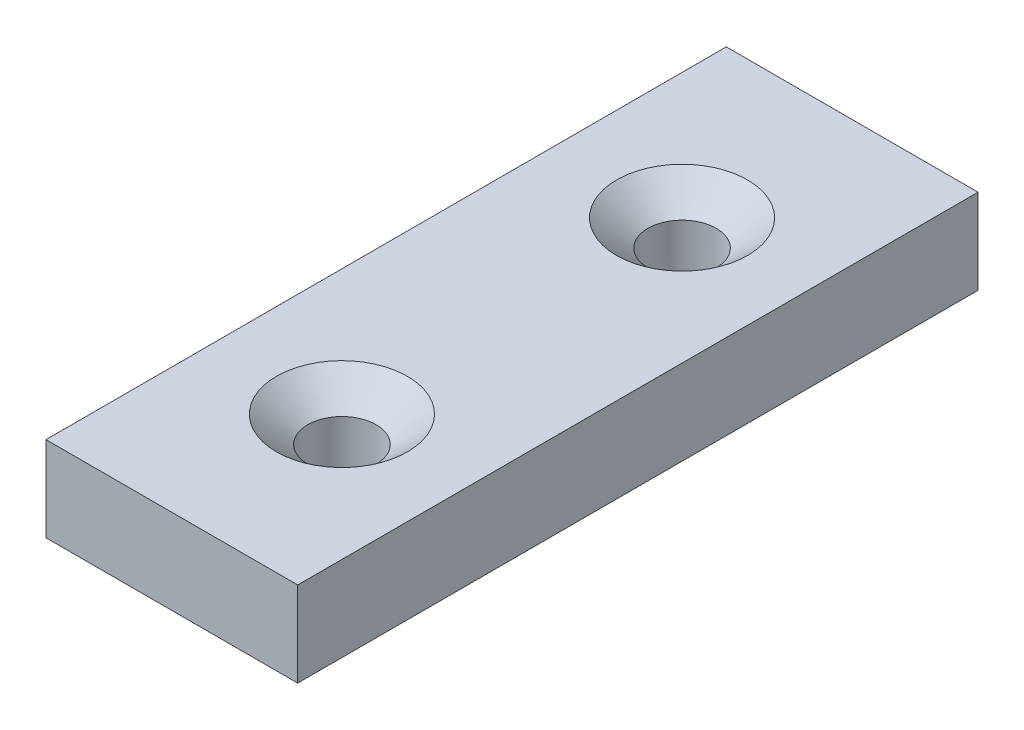
ISO-10303-21;
HEADER;
FILE_DESCRIPTION(('STEP AP214'),'2;1');
FILE_NAME('part.step','',(''),(''),'','','');
FILE_SCHEMA(('AUTOMOTIVE_DESIGN { 1 0 10303 214 1 1 1 1 }'));
ENDSEC;
DATA;
#1=APPLICATION_CONTEXT('core data for automotive mechanical design processes');
#2=APPLICATION_PROTOCOL_DEFINITION('international standard','automotive_design',2000,#1);
#3=PRODUCT_CONTEXT('',#1,'mechanical');
#4=PRODUCT('Part','Part','',(#3));
#5=PRODUCT_RELATED_PRODUCT_CATEGORY('part','',(#4));
#6=PRODUCT_DEFINITION_FORMATION('','',#4);
#7=PRODUCT_DEFINITION_CONTEXT('part definition',#1,'design');
#8=PRODUCT_DEFINITION('design','',#6,#7);
#9=PRODUCT_DEFINITION_SHAPE('','',#8);
#10=(LENGTH_UNIT() NAMED_UNIT(*) SI_UNIT(.MILLI.,.METRE.));
#11=(NAMED_UNIT(*) PLANE_ANGLE_UNIT() SI_UNIT($,.RADIAN.));
#12=(NAMED_UNIT(*) SI_UNIT($,.STERADIAN.) SOLID_ANGLE_UNIT());
#13=UNCERTAINTY_MEASURE_WITH_UNIT(LENGTH_MEASURE(1.E-05),#10,'distance_accuracy_value','');
#14=(GEOMETRIC_REPRESENTATION_CONTEXT(3) GLOBAL_UNCERTAINTY_ASSIGNED_CONTEXT((#13)) GLOBAL_UNIT_ASSIGNED_CONTEXT((#10,
#11,#12)) REPRESENTATION_CONTEXT('',''));
#15=CARTESIAN_POINT('',(0.,0.,0.));
#16=DIRECTION('',(0.,0.,1.));
#17=DIRECTION('',(1.,0.,0.));
#18=AXIS2_PLACEMENT_3D('',#15,#16,#17);
#19=CARTESIAN_POINT('',(0.,6.35,0.));
#20=DIRECTION('',(1.,0.,0.));
#21=DIRECTION('',(0.,0.,-1.));
#22=AXIS2_PLACEMENT_3D('',#19,#20,#21);
#23=PLANE('',#22);
#24=DIRECTION('',(0.,0.,1.));
#25=VECTOR('',#24,1.);
#26=CARTESIAN_POINT('',(0.,0.,0.));
#27=LINE('',#26,#25);
#28=CARTESIAN_POINT('',(0.,0.,-50.8));
#29=VERTEX_POINT('',#28);
#30=CARTESIAN_POINT('',(0.,0.,0.));
#31=VERTEX_POINT('',#30);
#32=EDGE_CURVE('E110',#29,#31,#27,.T.);
#33=ORIENTED_EDGE('',*,*,#32,.T.);
#34=DIRECTION('',(0.,-1.,0.));
#35=VECTOR('',#34,1.);
#36=CARTESIAN_POINT('',(0.,6.35,0.));
#37=LINE('',#36,#35);
#38=CARTESIAN_POINT('',(0.,6.35,0.));
#39=VERTEX_POINT('',#38);
#40=EDGE_CURVE('E11',#39,#31,#37,.T.);
#41=ORIENTED_EDGE('',*,*,#40,.F.);
#42=DIRECTION('',(0.,0.,1.));
#43=VECTOR('',#42,1.);
#44=CARTESIAN_POINT('',(0.,6.35,0.));
#45=LINE('',#44,#43);
#46=CARTESIAN_POINT('',(0.,6.35,-50.8));
#47=VERTEX_POINT('',#46);
#48=EDGE_CURVE('E93',#47,#39,#45,.T.);
#49=ORIENTED_EDGE('',*,*,#48,.F.);
#50=DIRECTION('',(0.,-1.,0.));
#51=VECTOR('',#50,1.);
#52=CARTESIAN_POINT('',(0.,6.35,-50.8));
#53=LINE('',#52,#51);
#54=EDGE_CURVE('E106',#47,#29,#53,.T.);
#55=ORIENTED_EDGE('',*,*,#54,.T.);
#56=EDGE_LOOP('',(#33,#41,#49,#55));
#57=FACE_BOUND('',#56,.T.);
#58=ADVANCED_FACE('F39',(#57),#23,.F.);
#59=CARTESIAN_POINT('',(0.,6.35,0.));
#60=DIRECTION('',(0.,0.,-1.));
#61=DIRECTION('',(-1.,0.,0.));
#62=AXIS2_PLACEMENT_3D('',#59,#60,#61);
#63=PLANE('',#62);
#64=DIRECTION('',(1.,0.,0.));
#65=VECTOR('',#64,1.);
#66=CARTESIAN_POINT('',(0.,0.,0.));
#67=LINE('',#66,#65);
#68=CARTESIAN_POINT('',(18.796,0.,0.));
#69=VERTEX_POINT('',#68);
#70=EDGE_CURVE('E98',#31,#69,#67,.T.);
#71=ORIENTED_EDGE('',*,*,#70,.T.);
#72=DIRECTION('',(0.,-1.,0.));
#73=VECTOR('',#72,1.);
#74=CARTESIAN_POINT('',(18.796,6.35,0.));
#75=LINE('',#74,#73);
#76=CARTESIAN_POINT('',(18.796,6.35,0.));
#77=VERTEX_POINT('',#76);
#78=EDGE_CURVE('E49',#77,#69,#75,.T.);
#79=ORIENTED_EDGE('',*,*,#78,.F.);
#80=DIRECTION('',(1.,0.,0.));
#81=VECTOR('',#80,1.);
#82=CARTESIAN_POINT('',(0.,6.35,0.));
#83=LINE('',#82,#81);
#84=EDGE_CURVE('E88',#39,#77,#83,.T.);
#85=ORIENTED_EDGE('',*,*,#84,.F.);
#86=ORIENTED_EDGE('',*,*,#40,.T.);
#87=EDGE_LOOP('',(#71,#79,#85,#86));
#88=FACE_BOUND('',#87,.T.);
#89=ADVANCED_FACE('F97',(#88),#63,.F.);
#90=CARTESIAN_POINT('',(18.796,6.35,0.));
#91=DIRECTION('',(-1.,0.,0.));
#92=DIRECTION('',(0.,0.,1.));
#93=AXIS2_PLACEMENT_3D('',#90,#91,#92);
#94=PLANE('',#93);
#95=DIRECTION('',(0.,0.,-1.));
#96=VECTOR('',#95,1.);
#97=CARTESIAN_POINT('',(18.796,0.,0.));
#98=LINE('',#97,#96);
#99=CARTESIAN_POINT('',(18.796,0.,-50.8));
#100=VERTEX_POINT('',#99);
#101=EDGE_CURVE('E75',#69,#100,#98,.T.);
#102=ORIENTED_EDGE('',*,*,#101,.T.);
#103=DIRECTION('',(0.,-1.,0.));
#104=VECTOR('',#103,1.);
#105=CARTESIAN_POINT('',(18.796,6.35,-50.8));
#106=LINE('',#105,#104);
#107=CARTESIAN_POINT('',(18.796,6.35,-50.8));
#108=VERTEX_POINT('',#107);
#109=EDGE_CURVE('E100',#108,#100,#106,.T.);
#110=ORIENTED_EDGE('',*,*,#109,.F.);
#111=DIRECTION('',(0.,0.,-1.));
#112=VECTOR('',#111,1.);
#113=CARTESIAN_POINT('',(18.796,6.35,0.));
#114=LINE('',#113,#112);
#115=EDGE_CURVE('E91',#77,#108,#114,.T.);
#116=ORIENTED_EDGE('',*,*,#115,.F.);
#117=ORIENTED_EDGE('',*,*,#78,.T.);
#118=EDGE_LOOP('',(#102,#110,#116,#117));
#119=FACE_BOUND('',#118,.T.);
#120=ADVANCED_FACE('F102',(#119),#94,.F.);
#121=CARTESIAN_POINT('',(0.,6.35,-50.8));
#122=DIRECTION('',(0.,0.,1.));
#123=DIRECTION('',(1.,0.,0.));
#124=AXIS2_PLACEMENT_3D('',#121,#122,#123);
#125=PLANE('',#124);
#126=DIRECTION('',(-1.,0.,0.));
#127=VECTOR('',#126,1.);
#128=CARTESIAN_POINT('',(0.,0.,-50.8));
#129=LINE('',#128,#127);
#130=EDGE_CURVE('E81',#100,#29,#129,.T.);
#131=ORIENTED_EDGE('',*,*,#130,.T.);
#132=ORIENTED_EDGE('',*,*,#54,.F.);
#133=DIRECTION('',(-1.,0.,0.));
#134=VECTOR('',#133,1.);
#135=CARTESIAN_POINT('',(0.,6.35,-50.8));
#136=LINE('',#135,#134);
#137=EDGE_CURVE('E58',#108,#47,#136,.T.);
#138=ORIENTED_EDGE('',*,*,#137,.F.);
#139=ORIENTED_EDGE('',*,*,#109,.T.);
#140=EDGE_LOOP('',(#131,#132,#138,#139));
#141=FACE_BOUND('',#140,.T.);
#142=ADVANCED_FACE('F154',(#141),#125,.F.);
#143=CARTESIAN_POINT('',(0.,6.35,0.));
#144=DIRECTION('',(0.,-1.,0.));
#145=DIRECTION('',(0.,0.,-1.));
#146=AXIS2_PLACEMENT_3D('',#143,#144,#145);
#147=PLANE('',#146);
#148=CARTESIAN_POINT('',(9.398,6.35,-38.1));
#149=DIRECTION('',(0.,1.,0.));
#150=DIRECTION('',(0.,0.,1.));
#151=AXIS2_PLACEMENT_3D('',#148,#149,#150);
#152=CIRCLE('',#151,4.8895);
#153=CARTESIAN_POINT('',(9.398,6.35,-33.2105));
#154=VERTEX_POINT('',#153);
#155=EDGE_CURVE('E144',#154,#154,#152,.T.);
#156=ORIENTED_EDGE('',*,*,#155,.F.);
#157=EDGE_LOOP('',(#156));
#158=FACE_BOUND('',#157,.T.);
#159=CARTESIAN_POINT('',(9.398,6.35,-12.7));
#160=DIRECTION('',(0.,1.,0.));
#161=DIRECTION('',(0.,0.,1.));
#162=AXIS2_PLACEMENT_3D('',#159,#160,#161);
#163=CIRCLE('',#162,4.8895);
#164=CARTESIAN_POINT('',(9.398,6.35,-7.8105));
#165=VERTEX_POINT('',#164);
#166=EDGE_CURVE('E131',#165,#165,#163,.T.);
#167=ORIENTED_EDGE('',*,*,#166,.F.);
#168=EDGE_LOOP('',(#167));
#169=FACE_BOUND('',#168,.T.);
#170=ORIENTED_EDGE('',*,*,#48,.T.);
#171=ORIENTED_EDGE('',*,*,#84,.T.);
#172=ORIENTED_EDGE('',*,*,#115,.T.);
#173=ORIENTED_EDGE('',*,*,#137,.T.);
#174=EDGE_LOOP('',(#170,#171,#172,#173));
#175=FACE_BOUND('',#174,.T.);
#176=ADVANCED_FACE('F89',(#158,#169,#175),#147,.F.);
#177=CARTESIAN_POINT('',(0.,0.,0.));
#178=DIRECTION('',(0.,-1.,0.));
#179=DIRECTION('',(0.,0.,-1.));
#180=AXIS2_PLACEMENT_3D('',#177,#178,#179);
#181=PLANE('',#180);
#182=CARTESIAN_POINT('',(9.398,0.,-38.1));
#183=DIRECTION('',(0.,-1.,0.));
#184=DIRECTION('',(0.,0.,-1.));
#185=AXIS2_PLACEMENT_3D('',#182,#183,#184);
#186=CIRCLE('',#185,2.5527);
#187=CARTESIAN_POINT('',(9.398,0.,-40.6527));
#188=VERTEX_POINT('',#187);
#189=EDGE_CURVE('E42',#188,#188,#186,.T.);
#190=ORIENTED_EDGE('',*,*,#189,.F.);
#191=EDGE_LOOP('',(#190));
#192=FACE_BOUND('',#191,.T.);
#193=CARTESIAN_POINT('',(9.398,0.,-12.7));
#194=DIRECTION('',(0.,-1.,0.));
#195=DIRECTION('',(0.,0.,-1.));
#196=AXIS2_PLACEMENT_3D('',#193,#194,#195);
#197=CIRCLE('',#196,2.5527);
#198=CARTESIAN_POINT('',(9.398,0.,-15.2527));
#199=VERTEX_POINT('',#198);
#200=EDGE_CURVE('E114',#199,#199,#197,.T.);
#201=ORIENTED_EDGE('',*,*,#200,.F.);
#202=EDGE_LOOP('',(#201));
#203=FACE_BOUND('',#202,.T.);
#204=ORIENTED_EDGE('',*,*,#32,.F.);
#205=ORIENTED_EDGE('',*,*,#130,.F.);
#206=ORIENTED_EDGE('',*,*,#101,.F.);
#207=ORIENTED_EDGE('',*,*,#70,.F.);
#208=EDGE_LOOP('',(#204,#205,#206,#207));
#209=FACE_BOUND('',#208,.T.);
#210=ADVANCED_FACE('F153',(#192,#203,#209),#181,.T.);
#211=CARTESIAN_POINT('',(9.398,6.35,-12.7));
#212=DIRECTION('',(0.,1.,0.));
#213=DIRECTION('',(0.,0.,1.));
#214=AXIS2_PLACEMENT_3D('',#211,#212,#213);
#215=CYLINDRICAL_SURFACE('',#214,2.5527);
#216=ORIENTED_EDGE('',*,*,#200,.T.);
#217=EDGE_LOOP('',(#216));
#218=FACE_BOUND('',#217,.T.);
#219=CARTESIAN_POINT('',(9.398,4.38919198186493,-12.7));
#220=DIRECTION('',(0.,1.,0.));
#221=DIRECTION('',(0.,0.,1.));
#222=AXIS2_PLACEMENT_3D('',#219,#220,#221);
#223=CIRCLE('',#222,2.5527);
#224=CARTESIAN_POINT('',(9.398,4.38919198186493,-10.1473));
#225=VERTEX_POINT('',#224);
#226=EDGE_CURVE('E126',#225,#225,#223,.T.);
#227=ORIENTED_EDGE('',*,*,#226,.T.);
#228=EDGE_LOOP('',(#227));
#229=FACE_BOUND('',#228,.T.);
#230=ADVANCED_FACE('F161',(#218,#229),#215,.F.);
#231=CARTESIAN_POINT('',(9.398,6.35,-12.7));
#232=DIRECTION('',(0.,1.,0.));
#233=DIRECTION('',(0.,0.,1.));
#234=AXIS2_PLACEMENT_3D('',#231,#232,#233);
#235=CONICAL_SURFACE('',#234,4.8895,0.872664625997164);
#236=ORIENTED_EDGE('',*,*,#226,.F.);
#237=EDGE_LOOP('',(#236));
#238=FACE_BOUND('',#237,.T.);
#239=ORIENTED_EDGE('',*,*,#166,.T.);
#240=EDGE_LOOP('',(#239));
#241=FACE_BOUND('',#240,.T.);
#242=ADVANCED_FACE('F158',(#238,#241),#235,.F.);
#243=CARTESIAN_POINT('',(9.398,6.35,-38.1));
#244=DIRECTION('',(0.,1.,0.));
#245=DIRECTION('',(0.,0.,1.));
#246=AXIS2_PLACEMENT_3D('',#243,#244,#245);
#247=CYLINDRICAL_SURFACE('',#246,2.5527);
#248=ORIENTED_EDGE('',*,*,#189,.T.);
#249=EDGE_LOOP('',(#248));
#250=FACE_BOUND('',#249,.T.);
#251=CARTESIAN_POINT('',(9.398,4.38919198186493,-38.1));
#252=DIRECTION('',(0.,1.,0.));
#253=DIRECTION('',(0.,0.,1.));
#254=AXIS2_PLACEMENT_3D('',#251,#252,#253);
#255=CIRCLE('',#254,2.5527);
#256=CARTESIAN_POINT('',(9.398,4.38919198186493,-35.5473));
#257=VERTEX_POINT('',#256);
#258=EDGE_CURVE('E140',#257,#257,#255,.T.);
#259=ORIENTED_EDGE('',*,*,#258,.T.);
#260=EDGE_LOOP('',(#259));
#261=FACE_BOUND('',#260,.T.);
#262=ADVANCED_FACE('F160',(#250,#261),#247,.F.);
#263=CARTESIAN_POINT('',(9.398,6.35,-38.1));
#264=DIRECTION('',(0.,1.,0.));
#265=DIRECTION('',(0.,0.,1.));
#266=AXIS2_PLACEMENT_3D('',#263,#264,#265);
#267=CONICAL_SURFACE('',#266,4.8895,0.872664625997164);
#268=ORIENTED_EDGE('',*,*,#258,.F.);
#269=EDGE_LOOP('',(#268));
#270=FACE_BOUND('',#269,.T.);
#271=ORIENTED_EDGE('',*,*,#155,.T.);
#272=EDGE_LOOP('',(#271));
#273=FACE_BOUND('',#272,.T.);
#274=ADVANCED_FACE('F149',(#270,#273),#267,.F.);
#275=CLOSED_SHELL('',(#58,#89,#120,#142,#176,#210,#230,#242,#262,#274));
#276=MANIFOLD_SOLID_BREP('B2',#275);
#277=ADVANCED_BREP_SHAPE_REPRESENTATION('',(#18,#276),#14);
#278=SHAPE_DEFINITION_REPRESENTATION(#9,#277);
ENDSEC;
END-ISO-10303-21;
